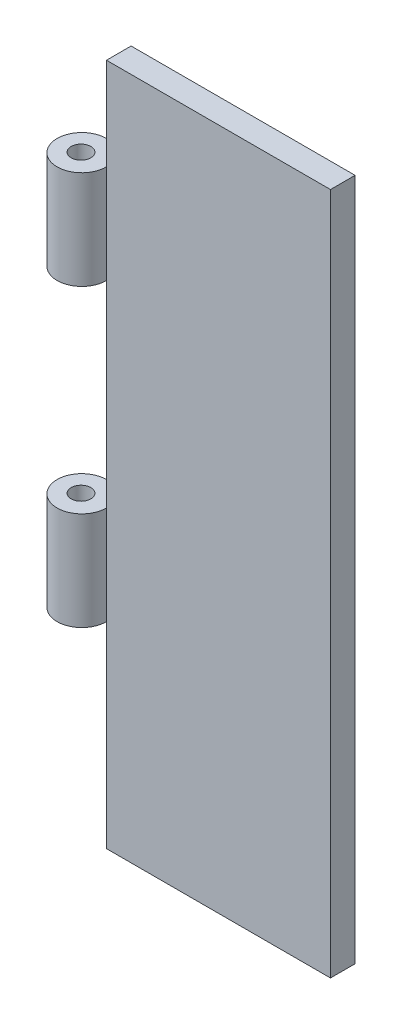
ISO-10303-21;
HEADER;
FILE_DESCRIPTION(('STEP AP214'),'2;1');
FILE_NAME('part.step','',(''),(''),'','','');
FILE_SCHEMA(('AUTOMOTIVE_DESIGN { 1 0 10303 214 1 1 1 1 }'));
ENDSEC;
DATA;
#1=APPLICATION_CONTEXT('core data for automotive mechanical design processes');
#2=APPLICATION_PROTOCOL_DEFINITION('international standard','automotive_design',2000,#1);
#3=PRODUCT_CONTEXT('',#1,'mechanical');
#4=PRODUCT('Part','Part','',(#3));
#5=PRODUCT_RELATED_PRODUCT_CATEGORY('part','',(#4));
#6=PRODUCT_DEFINITION_FORMATION('','',#4);
#7=PRODUCT_DEFINITION_CONTEXT('part definition',#1,'design');
#8=PRODUCT_DEFINITION('design','',#6,#7);
#9=PRODUCT_DEFINITION_SHAPE('','',#8);
#10=(LENGTH_UNIT() NAMED_UNIT(*) SI_UNIT(.MILLI.,.METRE.));
#11=(NAMED_UNIT(*) PLANE_ANGLE_UNIT() SI_UNIT($,.RADIAN.));
#12=(NAMED_UNIT(*) SI_UNIT($,.STERADIAN.) SOLID_ANGLE_UNIT());
#13=UNCERTAINTY_MEASURE_WITH_UNIT(LENGTH_MEASURE(1.E-05),#10,'distance_accuracy_value','');
#14=(GEOMETRIC_REPRESENTATION_CONTEXT(3) GLOBAL_UNCERTAINTY_ASSIGNED_CONTEXT((#13)) GLOBAL_UNIT_ASSIGNED_CONTEXT((#10,
#11,#12)) REPRESENTATION_CONTEXT('',''));
#15=CARTESIAN_POINT('',(0.,0.,0.));
#16=DIRECTION('',(0.,0.,1.));
#17=DIRECTION('',(1.,0.,0.));
#18=AXIS2_PLACEMENT_3D('',#15,#16,#17);
#19=CARTESIAN_POINT('',(-45.4940556314645,68.7592663355794,5.));
#20=DIRECTION('',(1.,0.,0.));
#21=DIRECTION('',(0.,0.,-1.));
#22=AXIS2_PLACEMENT_3D('',#19,#20,#21);
#23=PLANE('',#22);
#24=DIRECTION('',(0.,0.,-1.));
#25=VECTOR('',#24,1.);
#26=CARTESIAN_POINT('',(-45.4940556314645,-10.,5.));
#27=LINE('',#26,#25);
#28=CARTESIAN_POINT('',(-45.4940556314645,-10.,5.));
#29=VERTEX_POINT('',#28);
#30=CARTESIAN_POINT('',(-45.4940556314645,-9.99999999999999,0.));
#31=VERTEX_POINT('',#30);
#32=EDGE_CURVE('E65',#29,#31,#27,.T.);
#33=ORIENTED_EDGE('',*,*,#32,.F.);
#34=DIRECTION('',(0.,-1.,0.));
#35=VECTOR('',#34,1.);
#36=CARTESIAN_POINT('',(-45.4940556314645,68.7592663355794,5.));
#37=LINE('',#36,#35);
#38=CARTESIAN_POINT('',(-45.4940556314645,30.,5.));
#39=VERTEX_POINT('',#38);
#40=EDGE_CURVE('E184',#39,#29,#37,.T.);
#41=ORIENTED_EDGE('',*,*,#40,.F.);
#42=DIRECTION('',(0.,0.,-1.));
#43=VECTOR('',#42,1.);
#44=CARTESIAN_POINT('',(-45.4940556314645,30.,5.));
#45=LINE('',#44,#43);
#46=CARTESIAN_POINT('',(-45.4940556314645,30.,0.));
#47=VERTEX_POINT('',#46);
#48=EDGE_CURVE('E152',#39,#47,#45,.T.);
#49=ORIENTED_EDGE('',*,*,#48,.T.);
#50=DIRECTION('',(0.,-1.,0.));
#51=VECTOR('',#50,1.);
#52=CARTESIAN_POINT('',(-45.4940556314645,68.7592663355794,0.));
#53=LINE('',#52,#51);
#54=EDGE_CURVE('E192',#47,#31,#53,.T.);
#55=ORIENTED_EDGE('',*,*,#54,.T.);
#56=EDGE_LOOP('',(#33,#41,#49,#55));
#57=FACE_BOUND('',#56,.T.);
#58=ADVANCED_FACE('F41',(#57),#23,.F.);
#59=CARTESIAN_POINT('',(-45.4940556314645,-30.,5.));
#60=VERTEX_POINT('',#59);
#61=CARTESIAN_POINT('',(-45.4940556314645,-69.9305795969656,5.));
#62=VERTEX_POINT('',#61);
#63=EDGE_CURVE('E57',#60,#62,#37,.T.);
#64=ORIENTED_EDGE('',*,*,#63,.F.);
#65=DIRECTION('',(0.,0.,-1.));
#66=VECTOR('',#65,1.);
#67=CARTESIAN_POINT('',(-45.4940556314645,-30.,5.));
#68=LINE('',#67,#66);
#69=CARTESIAN_POINT('',(-45.4940556314645,-30.,0.));
#70=VERTEX_POINT('',#69);
#71=EDGE_CURVE('E138',#60,#70,#68,.T.);
#72=ORIENTED_EDGE('',*,*,#71,.T.);
#73=CARTESIAN_POINT('',(-45.4940556314645,-69.9305795969656,0.));
#74=VERTEX_POINT('',#73);
#75=EDGE_CURVE('E142',#70,#74,#53,.T.);
#76=ORIENTED_EDGE('',*,*,#75,.T.);
#77=DIRECTION('',(0.,0.,-1.));
#78=VECTOR('',#77,1.);
#79=CARTESIAN_POINT('',(-45.4940556314645,-69.9305795969656,5.));
#80=LINE('',#79,#78);
#81=EDGE_CURVE('E197',#62,#74,#80,.T.);
#82=ORIENTED_EDGE('',*,*,#81,.F.);
#83=EDGE_LOOP('',(#64,#72,#76,#82));
#84=FACE_BOUND('',#83,.T.);
#85=ADVANCED_FACE('F225',(#84),#23,.F.);
#86=CARTESIAN_POINT('',(0.,0.,5.));
#87=DIRECTION('',(-1.,0.,0.));
#88=DIRECTION('',(0.,0.,1.));
#89=AXIS2_PLACEMENT_3D('',#86,#87,#88);
#90=PLANE('',#89);
#91=DIRECTION('',(0.,1.,0.));
#92=VECTOR('',#91,1.);
#93=CARTESIAN_POINT('',(0.,0.,0.));
#94=LINE('',#93,#92);
#95=CARTESIAN_POINT('',(0.,-69.9305795969656,0.));
#96=VERTEX_POINT('',#95);
#97=CARTESIAN_POINT('',(0.,68.7592663355794,0.));
#98=VERTEX_POINT('',#97);
#99=EDGE_CURVE('E174',#96,#98,#94,.T.);
#100=ORIENTED_EDGE('',*,*,#99,.T.);
#101=DIRECTION('',(0.,0.,-1.));
#102=VECTOR('',#101,1.);
#103=CARTESIAN_POINT('',(0.,68.7592663355794,5.));
#104=LINE('',#103,#102);
#105=CARTESIAN_POINT('',(0.,68.7592663355794,5.));
#106=VERTEX_POINT('',#105);
#107=EDGE_CURVE('E11',#106,#98,#104,.T.);
#108=ORIENTED_EDGE('',*,*,#107,.F.);
#109=DIRECTION('',(0.,1.,0.));
#110=VECTOR('',#109,1.);
#111=CARTESIAN_POINT('',(0.,-69.9305795969656,5.));
#112=LINE('',#111,#110);
#113=CARTESIAN_POINT('',(0.,-69.9305795969656,5.));
#114=VERTEX_POINT('',#113);
#115=EDGE_CURVE('E175',#114,#106,#112,.T.);
#116=ORIENTED_EDGE('',*,*,#115,.F.);
#117=DIRECTION('',(0.,0.,-1.));
#118=VECTOR('',#117,1.);
#119=CARTESIAN_POINT('',(0.,-69.9305795969656,5.));
#120=LINE('',#119,#118);
#121=EDGE_CURVE('E186',#114,#96,#120,.T.);
#122=ORIENTED_EDGE('',*,*,#121,.T.);
#123=EDGE_LOOP('',(#100,#108,#116,#122));
#124=FACE_BOUND('',#123,.T.);
#125=ADVANCED_FACE('F43',(#124),#90,.F.);
#126=CARTESIAN_POINT('',(0.,68.7592663355794,5.));
#127=DIRECTION('',(0.,-1.,0.));
#128=DIRECTION('',(0.,0.,-1.));
#129=AXIS2_PLACEMENT_3D('',#126,#127,#128);
#130=PLANE('',#129);
#131=DIRECTION('',(-1.,0.,0.));
#132=VECTOR('',#131,1.);
#133=CARTESIAN_POINT('',(0.,68.7592663355794,0.));
#134=LINE('',#133,#132);
#135=CARTESIAN_POINT('',(-45.4940556314645,68.7592663355794,0.));
#136=VERTEX_POINT('',#135);
#137=EDGE_CURVE('E188',#98,#136,#134,.T.);
#138=ORIENTED_EDGE('',*,*,#137,.T.);
#139=DIRECTION('',(0.,0.,-1.));
#140=VECTOR('',#139,1.);
#141=CARTESIAN_POINT('',(-45.4940556314645,68.7592663355794,5.));
#142=LINE('',#141,#140);
#143=CARTESIAN_POINT('',(-45.4940556314645,68.7592663355794,5.));
#144=VERTEX_POINT('',#143);
#145=EDGE_CURVE('E50',#144,#136,#142,.T.);
#146=ORIENTED_EDGE('',*,*,#145,.F.);
#147=DIRECTION('',(-1.,0.,0.));
#148=VECTOR('',#147,1.);
#149=CARTESIAN_POINT('',(0.,68.7592663355794,5.));
#150=LINE('',#149,#148);
#151=EDGE_CURVE('E177',#106,#144,#150,.T.);
#152=ORIENTED_EDGE('',*,*,#151,.F.);
#153=ORIENTED_EDGE('',*,*,#107,.T.);
#154=EDGE_LOOP('',(#138,#146,#152,#153));
#155=FACE_BOUND('',#154,.T.);
#156=ADVANCED_FACE('F219',(#155),#130,.F.);
#157=CARTESIAN_POINT('',(-45.4940556314645,50.,0.));
#158=VERTEX_POINT('',#157);
#159=EDGE_CURVE('E190',#136,#158,#53,.T.);
#160=ORIENTED_EDGE('',*,*,#159,.T.);
#161=DIRECTION('',(0.,0.,-1.));
#162=VECTOR('',#161,1.);
#163=CARTESIAN_POINT('',(-45.4940556314645,50.,5.));
#164=LINE('',#163,#162);
#165=CARTESIAN_POINT('',(-45.4940556314645,50.,5.));
#166=VERTEX_POINT('',#165);
#167=EDGE_CURVE('E153',#166,#158,#164,.T.);
#168=ORIENTED_EDGE('',*,*,#167,.F.);
#169=EDGE_CURVE('E180',#144,#166,#37,.T.);
#170=ORIENTED_EDGE('',*,*,#169,.F.);
#171=ORIENTED_EDGE('',*,*,#145,.T.);
#172=EDGE_LOOP('',(#160,#168,#170,#171));
#173=FACE_BOUND('',#172,.T.);
#174=ADVANCED_FACE('F205',(#173),#23,.F.);
#175=CARTESIAN_POINT('',(-45.4940556314645,-69.9305795969656,5.));
#176=DIRECTION('',(0.,1.,0.));
#177=DIRECTION('',(0.,0.,1.));
#178=AXIS2_PLACEMENT_3D('',#175,#176,#177);
#179=PLANE('',#178);
#180=DIRECTION('',(1.,0.,0.));
#181=VECTOR('',#180,1.);
#182=CARTESIAN_POINT('',(-45.4940556314645,-69.9305795969656,0.));
#183=LINE('',#182,#181);
#184=EDGE_CURVE('E178',#74,#96,#183,.T.);
#185=ORIENTED_EDGE('',*,*,#184,.T.);
#186=ORIENTED_EDGE('',*,*,#121,.F.);
#187=DIRECTION('',(1.,0.,0.));
#188=VECTOR('',#187,1.);
#189=CARTESIAN_POINT('',(-45.4940556314645,-69.9305795969656,5.));
#190=LINE('',#189,#188);
#191=EDGE_CURVE('E183',#62,#114,#190,.T.);
#192=ORIENTED_EDGE('',*,*,#191,.F.);
#193=ORIENTED_EDGE('',*,*,#81,.T.);
#194=EDGE_LOOP('',(#185,#186,#192,#193));
#195=FACE_BOUND('',#194,.T.);
#196=ADVANCED_FACE('F223',(#195),#179,.F.);
#197=CARTESIAN_POINT('',(0.,0.,5.));
#198=DIRECTION('',(0.,0.,1.));
#199=DIRECTION('',(1.,0.,0.));
#200=AXIS2_PLACEMENT_3D('',#197,#198,#199);
#201=PLANE('',#200);
#202=ORIENTED_EDGE('',*,*,#115,.T.);
#203=ORIENTED_EDGE('',*,*,#151,.T.);
#204=ORIENTED_EDGE('',*,*,#169,.T.);
#205=DIRECTION('',(0.,-1.,0.));
#206=VECTOR('',#205,1.);
#207=CARTESIAN_POINT('',(-45.4940556314645,50.,5.));
#208=LINE('',#207,#206);
#209=EDGE_CURVE('E162',#166,#39,#208,.T.);
#210=ORIENTED_EDGE('',*,*,#209,.T.);
#211=ORIENTED_EDGE('',*,*,#40,.T.);
#212=DIRECTION('',(0.,1.,0.));
#213=VECTOR('',#212,1.);
#214=CARTESIAN_POINT('',(-45.4940556314645,-30.,5.));
#215=LINE('',#214,#213);
#216=EDGE_CURVE('E131',#60,#29,#215,.T.);
#217=ORIENTED_EDGE('',*,*,#216,.F.);
#218=ORIENTED_EDGE('',*,*,#63,.T.);
#219=ORIENTED_EDGE('',*,*,#191,.T.);
#220=EDGE_LOOP('',(#202,#203,#204,#210,#211,#217,#218,#219));
#221=FACE_BOUND('',#220,.T.);
#222=ADVANCED_FACE('F216',(#221),#201,.T.);
#223=CARTESIAN_POINT('',(0.,0.,0.));
#224=DIRECTION('',(0.,0.,1.));
#225=DIRECTION('',(1.,0.,0.));
#226=AXIS2_PLACEMENT_3D('',#223,#224,#225);
#227=PLANE('',#226);
#228=ORIENTED_EDGE('',*,*,#99,.F.);
#229=ORIENTED_EDGE('',*,*,#184,.F.);
#230=ORIENTED_EDGE('',*,*,#75,.F.);
#231=DIRECTION('',(-1.,0.,0.));
#232=VECTOR('',#231,1.);
#233=CARTESIAN_POINT('',(-45.4940556314645,-30.,0.));
#234=LINE('',#233,#232);
#235=CARTESIAN_POINT('',(-50.5026342010269,-30.,0.));
#236=VERTEX_POINT('',#235);
#237=EDGE_CURVE('E132',#70,#236,#234,.T.);
#238=ORIENTED_EDGE('',*,*,#237,.T.);
#239=DIRECTION('',(0.,1.,0.));
#240=VECTOR('',#239,1.);
#241=CARTESIAN_POINT('',(-50.5026342010269,-30.,0.));
#242=LINE('',#241,#240);
#243=CARTESIAN_POINT('',(-50.5026342010269,-10.,0.));
#244=VERTEX_POINT('',#243);
#245=EDGE_CURVE('E120',#236,#244,#242,.T.);
#246=ORIENTED_EDGE('',*,*,#245,.T.);
#247=DIRECTION('',(-1.,0.,0.));
#248=VECTOR('',#247,1.);
#249=CARTESIAN_POINT('',(-45.4940556314645,-10.,0.));
#250=LINE('',#249,#248);
#251=EDGE_CURVE('E149',#31,#244,#250,.T.);
#252=ORIENTED_EDGE('',*,*,#251,.F.);
#253=ORIENTED_EDGE('',*,*,#54,.F.);
#254=DIRECTION('',(-1.,0.,0.));
#255=VECTOR('',#254,1.);
#256=CARTESIAN_POINT('',(-45.4940556314645,30.,0.));
#257=LINE('',#256,#255);
#258=CARTESIAN_POINT('',(-50.5026342010269,30.,0.));
#259=VERTEX_POINT('',#258);
#260=EDGE_CURVE('E165',#47,#259,#257,.T.);
#261=ORIENTED_EDGE('',*,*,#260,.T.);
#262=DIRECTION('',(0.,-1.,0.));
#263=VECTOR('',#262,1.);
#264=CARTESIAN_POINT('',(-50.5026342010269,50.,0.));
#265=LINE('',#264,#263);
#266=CARTESIAN_POINT('',(-50.5026342010269,50.,0.));
#267=VERTEX_POINT('',#266);
#268=EDGE_CURVE('E171',#267,#259,#265,.T.);
#269=ORIENTED_EDGE('',*,*,#268,.F.);
#270=DIRECTION('',(-1.,0.,0.));
#271=VECTOR('',#270,1.);
#272=CARTESIAN_POINT('',(-45.4940556314645,50.,0.));
#273=LINE('',#272,#271);
#274=EDGE_CURVE('E156',#158,#267,#273,.T.);
#275=ORIENTED_EDGE('',*,*,#274,.F.);
#276=ORIENTED_EDGE('',*,*,#159,.F.);
#277=ORIENTED_EDGE('',*,*,#137,.F.);
#278=EDGE_LOOP('',(#228,#229,#230,#238,#246,#252,#253,#261,#269,#275,#276,#277));
#279=FACE_BOUND('',#278,.T.);
#280=ADVANCED_FACE('F140',(#279),#227,.F.);
#281=CARTESIAN_POINT('',(-50.5026342010269,50.,5.008585928748));
#282=DIRECTION('',(0.,-1.,0.));
#283=DIRECTION('',(0.,0.,-1.));
#284=AXIS2_PLACEMENT_3D('',#281,#282,#283);
#285=CYLINDRICAL_SURFACE('',#284,5.008585928748);
#286=CARTESIAN_POINT('',(-50.5026342010269,30.,5.008585928748));
#287=DIRECTION('',(0.,1.,0.));
#288=DIRECTION('',(0.,0.,1.));
#289=AXIS2_PLACEMENT_3D('',#286,#287,#288);
#290=CIRCLE('',#289,5.008585928748);
#291=EDGE_CURVE('E157',#259,#39,#290,.T.);
#292=ORIENTED_EDGE('',*,*,#291,.T.);
#293=ORIENTED_EDGE('',*,*,#209,.F.);
#294=CARTESIAN_POINT('',(-50.5026342010269,50.,5.008585928748));
#295=DIRECTION('',(0.,1.,0.));
#296=DIRECTION('',(0.,0.,1.));
#297=AXIS2_PLACEMENT_3D('',#294,#295,#296);
#298=CIRCLE('',#297,5.008585928748);
#299=EDGE_CURVE('E159',#267,#166,#298,.T.);
#300=ORIENTED_EDGE('',*,*,#299,.F.);
#301=ORIENTED_EDGE('',*,*,#268,.T.);
#302=EDGE_LOOP('',(#292,#293,#300,#301));
#303=FACE_BOUND('',#302,.T.);
#304=ADVANCED_FACE('F297',(#303),#285,.T.);
#305=CARTESIAN_POINT('',(-50.5026342010269,50.,5.008585928748));
#306=DIRECTION('',(0.,1.,0.));
#307=DIRECTION('',(0.,0.,1.));
#308=AXIS2_PLACEMENT_3D('',#305,#306,#307);
#309=PLANE('',#308);
#310=CARTESIAN_POINT('',(-50.6789100588059,50.,4.99578708670108));
#311=DIRECTION('',(0.,1.,0.));
#312=DIRECTION('',(0.,0.,1.));
#313=AXIS2_PLACEMENT_3D('',#310,#311,#312);
#314=CIRCLE('',#313,2.);
#315=CARTESIAN_POINT('',(-50.6789100588059,50.,6.99578708670109));
#316=VERTEX_POINT('',#315);
#317=EDGE_CURVE('E368',#316,#316,#314,.T.);
#318=ORIENTED_EDGE('',*,*,#317,.F.);
#319=EDGE_LOOP('',(#318));
#320=FACE_BOUND('',#319,.T.);
#321=ORIENTED_EDGE('',*,*,#167,.T.);
#322=ORIENTED_EDGE('',*,*,#274,.T.);
#323=ORIENTED_EDGE('',*,*,#299,.T.);
#324=EDGE_LOOP('',(#321,#322,#323));
#325=FACE_BOUND('',#324,.T.);
#326=ADVANCED_FACE('F213',(#320,#325),#309,.T.);
#327=CARTESIAN_POINT('',(-50.5026342010269,30.,5.008585928748));
#328=DIRECTION('',(0.,1.,0.));
#329=DIRECTION('',(0.,0.,1.));
#330=AXIS2_PLACEMENT_3D('',#327,#328,#329);
#331=PLANE('',#330);
#332=CARTESIAN_POINT('',(-50.6789100588059,30.,4.99578708670108));
#333=DIRECTION('',(0.,1.,0.));
#334=DIRECTION('',(0.,0.,1.));
#335=AXIS2_PLACEMENT_3D('',#332,#333,#334);
#336=CIRCLE('',#335,2.);
#337=CARTESIAN_POINT('',(-50.6789100588059,30.,6.99578708670109));
#338=VERTEX_POINT('',#337);
#339=EDGE_CURVE('E147',#338,#338,#336,.T.);
#340=ORIENTED_EDGE('',*,*,#339,.T.);
#341=EDGE_LOOP('',(#340));
#342=FACE_BOUND('',#341,.T.);
#343=ORIENTED_EDGE('',*,*,#48,.F.);
#344=ORIENTED_EDGE('',*,*,#291,.F.);
#345=ORIENTED_EDGE('',*,*,#260,.F.);
#346=EDGE_LOOP('',(#343,#344,#345));
#347=FACE_BOUND('',#346,.T.);
#348=ADVANCED_FACE('F320',(#342,#347),#331,.F.);
#349=CARTESIAN_POINT('',(-50.5026342010269,-30.,5.008585928748));
#350=DIRECTION('',(0.,1.,0.));
#351=DIRECTION('',(0.,0.,1.));
#352=AXIS2_PLACEMENT_3D('',#349,#350,#351);
#353=CYLINDRICAL_SURFACE('',#352,5.008585928748);
#354=CARTESIAN_POINT('',(-50.5026342010269,-10.,5.008585928748));
#355=DIRECTION('',(0.,1.,0.));
#356=DIRECTION('',(0.,0.,1.));
#357=AXIS2_PLACEMENT_3D('',#354,#355,#356);
#358=CIRCLE('',#357,5.008585928748);
#359=EDGE_CURVE('E126',#244,#29,#358,.T.);
#360=ORIENTED_EDGE('',*,*,#359,.F.);
#361=ORIENTED_EDGE('',*,*,#245,.F.);
#362=CARTESIAN_POINT('',(-50.5026342010269,-30.,5.008585928748));
#363=DIRECTION('',(0.,1.,0.));
#364=DIRECTION('',(0.,0.,1.));
#365=AXIS2_PLACEMENT_3D('',#362,#363,#364);
#366=CIRCLE('',#365,5.008585928748);
#367=EDGE_CURVE('E124',#236,#60,#366,.T.);
#368=ORIENTED_EDGE('',*,*,#367,.T.);
#369=ORIENTED_EDGE('',*,*,#216,.T.);
#370=EDGE_LOOP('',(#360,#361,#368,#369));
#371=FACE_BOUND('',#370,.T.);
#372=ADVANCED_FACE('F122',(#371),#353,.T.);
#373=CARTESIAN_POINT('',(-50.5026342010269,-30.,5.008585928748));
#374=DIRECTION('',(0.,-1.,0.));
#375=DIRECTION('',(0.,0.,1.));
#376=AXIS2_PLACEMENT_3D('',#373,#374,#375);
#377=PLANE('',#376);
#378=CARTESIAN_POINT('',(-50.6789100588059,-30.,4.99578708670108));
#379=DIRECTION('',(0.,-1.,0.));
#380=DIRECTION('',(0.,0.,-1.));
#381=AXIS2_PLACEMENT_3D('',#378,#379,#380);
#382=CIRCLE('',#381,2.);
#383=CARTESIAN_POINT('',(-50.6789100588059,-30.,2.99578708670108));
#384=VERTEX_POINT('',#383);
#385=EDGE_CURVE('E371',#384,#384,#382,.T.);
#386=ORIENTED_EDGE('',*,*,#385,.F.);
#387=EDGE_LOOP('',(#386));
#388=FACE_BOUND('',#387,.T.);
#389=ORIENTED_EDGE('',*,*,#71,.F.);
#390=ORIENTED_EDGE('',*,*,#367,.F.);
#391=ORIENTED_EDGE('',*,*,#237,.F.);
#392=EDGE_LOOP('',(#389,#390,#391));
#393=FACE_BOUND('',#392,.T.);
#394=ADVANCED_FACE('F137',(#388,#393),#377,.T.);
#395=CARTESIAN_POINT('',(-50.5026342010269,-10.,5.008585928748));
#396=DIRECTION('',(0.,-1.,0.));
#397=DIRECTION('',(0.,0.,1.));
#398=AXIS2_PLACEMENT_3D('',#395,#396,#397);
#399=PLANE('',#398);
#400=CARTESIAN_POINT('',(-50.6789100588059,-10.,4.99578708670108));
#401=DIRECTION('',(0.,-1.,0.));
#402=DIRECTION('',(0.,0.,-1.));
#403=AXIS2_PLACEMENT_3D('',#400,#401,#402);
#404=CIRCLE('',#403,2.);
#405=CARTESIAN_POINT('',(-50.6789100588059,-10.,2.99578708670108));
#406=VERTEX_POINT('',#405);
#407=EDGE_CURVE('E45',#406,#406,#404,.T.);
#408=ORIENTED_EDGE('',*,*,#407,.T.);
#409=EDGE_LOOP('',(#408));
#410=FACE_BOUND('',#409,.T.);
#411=ORIENTED_EDGE('',*,*,#32,.T.);
#412=ORIENTED_EDGE('',*,*,#251,.T.);
#413=ORIENTED_EDGE('',*,*,#359,.T.);
#414=EDGE_LOOP('',(#411,#412,#413));
#415=FACE_BOUND('',#414,.T.);
#416=ADVANCED_FACE('F229',(#410,#415),#399,.F.);
#417=CARTESIAN_POINT('',(-50.6789100588059,-69.9305795969656,4.99578708670108));
#418=DIRECTION('',(0.,1.,0.));
#419=DIRECTION('',(0.,0.,1.));
#420=AXIS2_PLACEMENT_3D('',#417,#418,#419);
#421=CYLINDRICAL_SURFACE('',#420,2.);
#422=ORIENTED_EDGE('',*,*,#385,.T.);
#423=EDGE_LOOP('',(#422));
#424=FACE_BOUND('',#423,.T.);
#425=ORIENTED_EDGE('',*,*,#407,.F.);
#426=EDGE_LOOP('',(#425));
#427=FACE_BOUND('',#426,.T.);
#428=ADVANCED_FACE('F231',(#424,#427),#421,.F.);
#429=ORIENTED_EDGE('',*,*,#317,.T.);
#430=EDGE_LOOP('',(#429));
#431=FACE_BOUND('',#430,.T.);
#432=ORIENTED_EDGE('',*,*,#339,.F.);
#433=EDGE_LOOP('',(#432));
#434=FACE_BOUND('',#433,.T.);
#435=ADVANCED_FACE('F238',(#431,#434),#421,.F.);
#436=CLOSED_SHELL('',(#58,#85,#125,#156,#174,#196,#222,#280,#304,#326,#348,#372,#394,#416,#428,#435));
#437=MANIFOLD_SOLID_BREP('B2',#436);
#438=ADVANCED_BREP_SHAPE_REPRESENTATION('',(#18,#437),#14);
#439=SHAPE_DEFINITION_REPRESENTATION(#9,#438);
ENDSEC;
END-ISO-10303-21;
